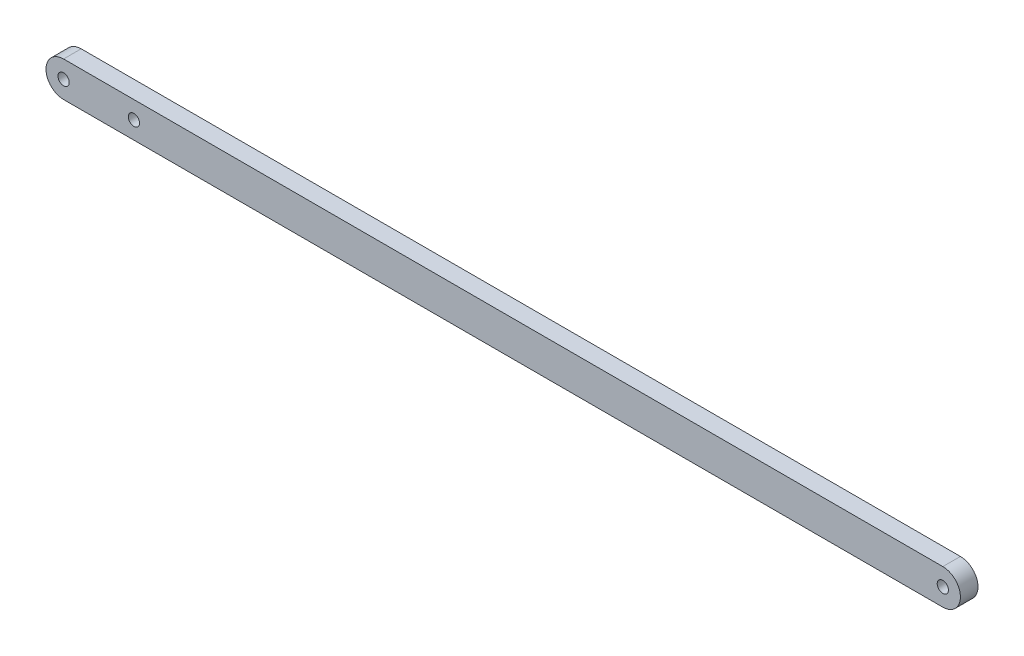
ISO-10303-21;
HEADER;
FILE_DESCRIPTION(('STEP AP214'),'2;1');
FILE_NAME('part.step','',(''),(''),'','','');
FILE_SCHEMA(('AUTOMOTIVE_DESIGN { 1 0 10303 214 1 1 1 1 }'));
ENDSEC;
DATA;
#1=APPLICATION_CONTEXT('core data for automotive mechanical design processes');
#2=APPLICATION_PROTOCOL_DEFINITION('international standard','automotive_design',2000,#1);
#3=PRODUCT_CONTEXT('',#1,'mechanical');
#4=PRODUCT('Part','Part','',(#3));
#5=PRODUCT_RELATED_PRODUCT_CATEGORY('part','',(#4));
#6=PRODUCT_DEFINITION_FORMATION('','',#4);
#7=PRODUCT_DEFINITION_CONTEXT('part definition',#1,'design');
#8=PRODUCT_DEFINITION('design','',#6,#7);
#9=PRODUCT_DEFINITION_SHAPE('','',#8);
#10=(LENGTH_UNIT() NAMED_UNIT(*) SI_UNIT(.MILLI.,.METRE.));
#11=(NAMED_UNIT(*) PLANE_ANGLE_UNIT() SI_UNIT($,.RADIAN.));
#12=(NAMED_UNIT(*) SI_UNIT($,.STERADIAN.) SOLID_ANGLE_UNIT());
#13=UNCERTAINTY_MEASURE_WITH_UNIT(LENGTH_MEASURE(1.E-05),#10,'distance_accuracy_value','');
#14=(GEOMETRIC_REPRESENTATION_CONTEXT(3) GLOBAL_UNCERTAINTY_ASSIGNED_CONTEXT((#13)) GLOBAL_UNIT_ASSIGNED_CONTEXT((#10,
#11,#12)) REPRESENTATION_CONTEXT('',''));
#15=CARTESIAN_POINT('',(0.,0.,0.));
#16=DIRECTION('',(0.,0.,1.));
#17=DIRECTION('',(1.,0.,0.));
#18=AXIS2_PLACEMENT_3D('',#15,#16,#17);
#19=CARTESIAN_POINT('',(0.,0.,3.175));
#20=DIRECTION('',(0.,0.,1.));
#21=DIRECTION('',(1.,0.,0.));
#22=AXIS2_PLACEMENT_3D('',#19,#20,#21);
#23=PLANE('',#22);
#24=CARTESIAN_POINT('',(317.5,0.,3.175));
#25=DIRECTION('',(0.,0.,1.));
#26=DIRECTION('',(1.,0.,0.));
#27=AXIS2_PLACEMENT_3D('',#24,#25,#26);
#28=CIRCLE('',#27,2.03199999999995);
#29=CARTESIAN_POINT('',(319.532,0.,3.175));
#30=VERTEX_POINT('',#29);
#31=EDGE_CURVE('E140',#30,#30,#28,.T.);
#32=ORIENTED_EDGE('',*,*,#31,.F.);
#33=EDGE_LOOP('',(#32));
#34=FACE_BOUND('',#33,.T.);
#35=CARTESIAN_POINT('',(0.,0.,3.175));
#36=DIRECTION('',(0.,0.,1.));
#37=DIRECTION('',(1.,0.,0.));
#38=AXIS2_PLACEMENT_3D('',#35,#36,#37);
#39=CIRCLE('',#38,6.35);
#40=CARTESIAN_POINT('',(0.,6.35,3.175));
#41=VERTEX_POINT('',#40);
#42=CARTESIAN_POINT('',(0.,-6.35,3.175));
#43=VERTEX_POINT('',#42);
#44=EDGE_CURVE('E98',#41,#43,#39,.T.);
#45=ORIENTED_EDGE('',*,*,#44,.T.);
#46=DIRECTION('',(1.,0.,0.));
#47=VECTOR('',#46,1.);
#48=CARTESIAN_POINT('',(0.,-6.35,3.175));
#49=LINE('',#48,#47);
#50=CARTESIAN_POINT('',(317.5,-6.35,3.175));
#51=VERTEX_POINT('',#50);
#52=EDGE_CURVE('E93',#43,#51,#49,.T.);
#53=ORIENTED_EDGE('',*,*,#52,.T.);
#54=CARTESIAN_POINT('',(317.5,0.,3.175));
#55=DIRECTION('',(0.,0.,1.));
#56=DIRECTION('',(1.,0.,0.));
#57=AXIS2_PLACEMENT_3D('',#54,#55,#56);
#58=CIRCLE('',#57,6.35);
#59=CARTESIAN_POINT('',(317.5,6.35,3.175));
#60=VERTEX_POINT('',#59);
#61=EDGE_CURVE('E96',#51,#60,#58,.T.);
#62=ORIENTED_EDGE('',*,*,#61,.T.);
#63=DIRECTION('',(-1.,0.,0.));
#64=VECTOR('',#63,1.);
#65=CARTESIAN_POINT('',(0.,6.35,3.175));
#66=LINE('',#65,#64);
#67=EDGE_CURVE('E63',#60,#41,#66,.T.);
#68=ORIENTED_EDGE('',*,*,#67,.T.);
#69=EDGE_LOOP('',(#45,#53,#62,#68));
#70=FACE_BOUND('',#69,.T.);
#71=CARTESIAN_POINT('',(0.,0.,3.175));
#72=DIRECTION('',(0.,0.,1.));
#73=DIRECTION('',(1.,0.,0.));
#74=AXIS2_PLACEMENT_3D('',#71,#72,#73);
#75=CIRCLE('',#74,2.032);
#76=CARTESIAN_POINT('',(2.03200000000003,0.,3.175));
#77=VERTEX_POINT('',#76);
#78=EDGE_CURVE('E118',#77,#77,#75,.T.);
#79=ORIENTED_EDGE('',*,*,#78,.F.);
#80=EDGE_LOOP('',(#79));
#81=FACE_BOUND('',#80,.T.);
#82=CARTESIAN_POINT('',(25.4,0.,3.175));
#83=DIRECTION('',(0.,0.,1.));
#84=DIRECTION('',(1.,0.,0.));
#85=AXIS2_PLACEMENT_3D('',#82,#83,#84);
#86=CIRCLE('',#85,2.032);
#87=CARTESIAN_POINT('',(27.432,0.,3.175));
#88=VERTEX_POINT('',#87);
#89=EDGE_CURVE('E148',#88,#88,#86,.T.);
#90=ORIENTED_EDGE('',*,*,#89,.F.);
#91=EDGE_LOOP('',(#90));
#92=FACE_BOUND('',#91,.T.);
#93=ADVANCED_FACE('F45',(#34,#70,#81,#92),#23,.T.);
#94=CARTESIAN_POINT('',(0.,0.,-3.175));
#95=DIRECTION('',(0.,0.,1.));
#96=DIRECTION('',(1.,0.,0.));
#97=AXIS2_PLACEMENT_3D('',#94,#95,#96);
#98=PLANE('',#97);
#99=CARTESIAN_POINT('',(0.,0.,-3.175));
#100=DIRECTION('',(0.,0.,1.));
#101=DIRECTION('',(1.,0.,0.));
#102=AXIS2_PLACEMENT_3D('',#99,#100,#101);
#103=CIRCLE('',#102,6.35);
#104=CARTESIAN_POINT('',(0.,6.35,-3.175));
#105=VERTEX_POINT('',#104);
#106=CARTESIAN_POINT('',(0.,-6.35,-3.175));
#107=VERTEX_POINT('',#106);
#108=EDGE_CURVE('E114',#105,#107,#103,.T.);
#109=ORIENTED_EDGE('',*,*,#108,.F.);
#110=DIRECTION('',(-1.,0.,0.));
#111=VECTOR('',#110,1.);
#112=CARTESIAN_POINT('',(0.,6.35,-3.175));
#113=LINE('',#112,#111);
#114=CARTESIAN_POINT('',(317.5,6.35,-3.175));
#115=VERTEX_POINT('',#114);
#116=EDGE_CURVE('E86',#115,#105,#113,.T.);
#117=ORIENTED_EDGE('',*,*,#116,.F.);
#118=CARTESIAN_POINT('',(317.5,0.,-3.175));
#119=DIRECTION('',(0.,0.,1.));
#120=DIRECTION('',(1.,0.,0.));
#121=AXIS2_PLACEMENT_3D('',#118,#119,#120);
#122=CIRCLE('',#121,6.35);
#123=CARTESIAN_POINT('',(317.5,-6.35,-3.175));
#124=VERTEX_POINT('',#123);
#125=EDGE_CURVE('E80',#124,#115,#122,.T.);
#126=ORIENTED_EDGE('',*,*,#125,.F.);
#127=DIRECTION('',(1.,0.,0.));
#128=VECTOR('',#127,1.);
#129=CARTESIAN_POINT('',(0.,-6.35,-3.175));
#130=LINE('',#129,#128);
#131=EDGE_CURVE('E103',#107,#124,#130,.T.);
#132=ORIENTED_EDGE('',*,*,#131,.F.);
#133=EDGE_LOOP('',(#109,#117,#126,#132));
#134=FACE_BOUND('',#133,.T.);
#135=CARTESIAN_POINT('',(0.,0.,-3.175));
#136=DIRECTION('',(0.,0.,1.));
#137=DIRECTION('',(1.,0.,0.));
#138=AXIS2_PLACEMENT_3D('',#135,#136,#137);
#139=CIRCLE('',#138,2.032);
#140=CARTESIAN_POINT('',(2.03200000000003,0.,-3.175));
#141=VERTEX_POINT('',#140);
#142=EDGE_CURVE('E136',#141,#141,#139,.T.);
#143=ORIENTED_EDGE('',*,*,#142,.T.);
#144=EDGE_LOOP('',(#143));
#145=FACE_BOUND('',#144,.T.);
#146=CARTESIAN_POINT('',(317.5,0.,-3.175));
#147=DIRECTION('',(0.,0.,1.));
#148=DIRECTION('',(1.,0.,0.));
#149=AXIS2_PLACEMENT_3D('',#146,#147,#148);
#150=CIRCLE('',#149,2.03199999999995);
#151=CARTESIAN_POINT('',(319.532,0.,-3.175));
#152=VERTEX_POINT('',#151);
#153=EDGE_CURVE('E144',#152,#152,#150,.T.);
#154=ORIENTED_EDGE('',*,*,#153,.T.);
#155=EDGE_LOOP('',(#154));
#156=FACE_BOUND('',#155,.T.);
#157=CARTESIAN_POINT('',(25.4,0.,-3.175));
#158=DIRECTION('',(0.,0.,1.));
#159=DIRECTION('',(1.,0.,0.));
#160=AXIS2_PLACEMENT_3D('',#157,#158,#159);
#161=CIRCLE('',#160,2.032);
#162=CARTESIAN_POINT('',(27.432,0.,-3.175));
#163=VERTEX_POINT('',#162);
#164=EDGE_CURVE('E152',#163,#163,#161,.T.);
#165=ORIENTED_EDGE('',*,*,#164,.T.);
#166=EDGE_LOOP('',(#165));
#167=FACE_BOUND('',#166,.T.);
#168=ADVANCED_FACE('F131',(#134,#145,#156,#167),#98,.F.);
#169=CARTESIAN_POINT('',(0.,0.,3.175));
#170=DIRECTION('',(0.,0.,-1.));
#171=DIRECTION('',(-1.,0.,0.));
#172=AXIS2_PLACEMENT_3D('',#169,#170,#171);
#173=CYLINDRICAL_SURFACE('',#172,6.35);
#174=ORIENTED_EDGE('',*,*,#108,.T.);
#175=DIRECTION('',(0.,0.,-1.));
#176=VECTOR('',#175,1.);
#177=CARTESIAN_POINT('',(0.,-6.35,3.175));
#178=LINE('',#177,#176);
#179=EDGE_CURVE('E11',#43,#107,#178,.T.);
#180=ORIENTED_EDGE('',*,*,#179,.F.);
#181=ORIENTED_EDGE('',*,*,#44,.F.);
#182=DIRECTION('',(0.,0.,-1.));
#183=VECTOR('',#182,1.);
#184=CARTESIAN_POINT('',(0.,6.35,3.175));
#185=LINE('',#184,#183);
#186=EDGE_CURVE('E110',#41,#105,#185,.T.);
#187=ORIENTED_EDGE('',*,*,#186,.T.);
#188=EDGE_LOOP('',(#174,#180,#181,#187));
#189=FACE_BOUND('',#188,.T.);
#190=ADVANCED_FACE('F47',(#189),#173,.T.);
#191=CARTESIAN_POINT('',(0.,-6.35,3.175));
#192=DIRECTION('',(0.,1.,0.));
#193=DIRECTION('',(0.,0.,1.));
#194=AXIS2_PLACEMENT_3D('',#191,#192,#193);
#195=PLANE('',#194);
#196=ORIENTED_EDGE('',*,*,#131,.T.);
#197=DIRECTION('',(0.,0.,-1.));
#198=VECTOR('',#197,1.);
#199=CARTESIAN_POINT('',(317.5,-6.35,3.175));
#200=LINE('',#199,#198);
#201=EDGE_CURVE('E55',#51,#124,#200,.T.);
#202=ORIENTED_EDGE('',*,*,#201,.F.);
#203=ORIENTED_EDGE('',*,*,#52,.F.);
#204=ORIENTED_EDGE('',*,*,#179,.T.);
#205=EDGE_LOOP('',(#196,#202,#203,#204));
#206=FACE_BOUND('',#205,.T.);
#207=ADVANCED_FACE('F102',(#206),#195,.F.);
#208=CARTESIAN_POINT('',(317.5,0.,3.175));
#209=DIRECTION('',(0.,0.,-1.));
#210=DIRECTION('',(-1.,0.,0.));
#211=AXIS2_PLACEMENT_3D('',#208,#209,#210);
#212=CYLINDRICAL_SURFACE('',#211,6.35);
#213=ORIENTED_EDGE('',*,*,#125,.T.);
#214=DIRECTION('',(0.,0.,-1.));
#215=VECTOR('',#214,1.);
#216=CARTESIAN_POINT('',(317.5,6.35,3.175));
#217=LINE('',#216,#215);
#218=EDGE_CURVE('E105',#60,#115,#217,.T.);
#219=ORIENTED_EDGE('',*,*,#218,.F.);
#220=ORIENTED_EDGE('',*,*,#61,.F.);
#221=ORIENTED_EDGE('',*,*,#201,.T.);
#222=EDGE_LOOP('',(#213,#219,#220,#221));
#223=FACE_BOUND('',#222,.T.);
#224=ADVANCED_FACE('F106',(#223),#212,.T.);
#225=CARTESIAN_POINT('',(0.,6.35,3.175));
#226=DIRECTION('',(0.,-1.,0.));
#227=DIRECTION('',(0.,0.,-1.));
#228=AXIS2_PLACEMENT_3D('',#225,#226,#227);
#229=PLANE('',#228);
#230=ORIENTED_EDGE('',*,*,#116,.T.);
#231=ORIENTED_EDGE('',*,*,#186,.F.);
#232=ORIENTED_EDGE('',*,*,#67,.F.);
#233=ORIENTED_EDGE('',*,*,#218,.T.);
#234=EDGE_LOOP('',(#230,#231,#232,#233));
#235=FACE_BOUND('',#234,.T.);
#236=ADVANCED_FACE('F128',(#235),#229,.F.);
#237=CARTESIAN_POINT('',(0.,0.,3.175));
#238=DIRECTION('',(0.,0.,-1.));
#239=DIRECTION('',(-1.,0.,0.));
#240=AXIS2_PLACEMENT_3D('',#237,#238,#239);
#241=CYLINDRICAL_SURFACE('',#240,2.032);
#242=ORIENTED_EDGE('',*,*,#78,.T.);
#243=EDGE_LOOP('',(#242));
#244=FACE_BOUND('',#243,.T.);
#245=ORIENTED_EDGE('',*,*,#142,.F.);
#246=EDGE_LOOP('',(#245));
#247=FACE_BOUND('',#246,.T.);
#248=ADVANCED_FACE('F172',(#244,#247),#241,.F.);
#249=CARTESIAN_POINT('',(317.5,0.,3.175));
#250=DIRECTION('',(0.,0.,-1.));
#251=DIRECTION('',(-1.,0.,0.));
#252=AXIS2_PLACEMENT_3D('',#249,#250,#251);
#253=CYLINDRICAL_SURFACE('',#252,2.03199999999995);
#254=ORIENTED_EDGE('',*,*,#31,.T.);
#255=EDGE_LOOP('',(#254));
#256=FACE_BOUND('',#255,.T.);
#257=ORIENTED_EDGE('',*,*,#153,.F.);
#258=EDGE_LOOP('',(#257));
#259=FACE_BOUND('',#258,.T.);
#260=ADVANCED_FACE('F217',(#256,#259),#253,.F.);
#261=CARTESIAN_POINT('',(25.4,0.,3.175));
#262=DIRECTION('',(0.,0.,-1.));
#263=DIRECTION('',(-1.,0.,0.));
#264=AXIS2_PLACEMENT_3D('',#261,#262,#263);
#265=CYLINDRICAL_SURFACE('',#264,2.032);
#266=ORIENTED_EDGE('',*,*,#89,.T.);
#267=EDGE_LOOP('',(#266));
#268=FACE_BOUND('',#267,.T.);
#269=ORIENTED_EDGE('',*,*,#164,.F.);
#270=EDGE_LOOP('',(#269));
#271=FACE_BOUND('',#270,.T.);
#272=ADVANCED_FACE('F160',(#268,#271),#265,.F.);
#273=CLOSED_SHELL('',(#93,#168,#190,#207,#224,#236,#248,#260,#272));
#274=MANIFOLD_SOLID_BREP('B2',#273);
#275=ADVANCED_BREP_SHAPE_REPRESENTATION('',(#18,#274),#14);
#276=SHAPE_DEFINITION_REPRESENTATION(#9,#275);
ENDSEC;
END-ISO-10303-21;
